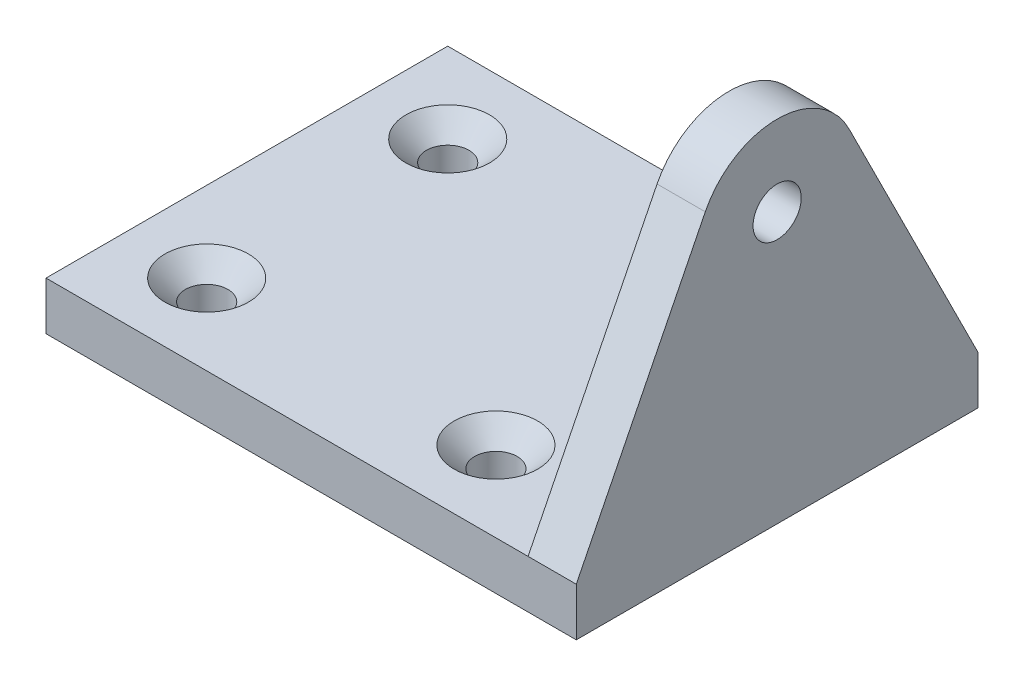
ISO-10303-21;
HEADER;
FILE_DESCRIPTION(('STEP AP214'),'2;1');
FILE_NAME('part.step','',(''),(''),'','','');
FILE_SCHEMA(('AUTOMOTIVE_DESIGN { 1 0 10303 214 1 1 1 1 }'));
ENDSEC;
DATA;
#1=APPLICATION_CONTEXT('core data for automotive mechanical design processes');
#2=APPLICATION_PROTOCOL_DEFINITION('international standard','automotive_design',2000,#1);
#3=PRODUCT_CONTEXT('',#1,'mechanical');
#4=PRODUCT('Part','Part','',(#3));
#5=PRODUCT_RELATED_PRODUCT_CATEGORY('part','',(#4));
#6=PRODUCT_DEFINITION_FORMATION('','',#4);
#7=PRODUCT_DEFINITION_CONTEXT('part definition',#1,'design');
#8=PRODUCT_DEFINITION('design','',#6,#7);
#9=PRODUCT_DEFINITION_SHAPE('','',#8);
#10=(LENGTH_UNIT() NAMED_UNIT(*) SI_UNIT(.MILLI.,.METRE.));
#11=(NAMED_UNIT(*) PLANE_ANGLE_UNIT() SI_UNIT($,.RADIAN.));
#12=(NAMED_UNIT(*) SI_UNIT($,.STERADIAN.) SOLID_ANGLE_UNIT());
#13=UNCERTAINTY_MEASURE_WITH_UNIT(LENGTH_MEASURE(1.E-05),#10,'distance_accuracy_value','');
#14=(GEOMETRIC_REPRESENTATION_CONTEXT(3) GLOBAL_UNCERTAINTY_ASSIGNED_CONTEXT((#13)) GLOBAL_UNIT_ASSIGNED_CONTEXT((#10,
#11,#12)) REPRESENTATION_CONTEXT('',''));
#15=CARTESIAN_POINT('',(0.,0.,0.));
#16=DIRECTION('',(0.,0.,1.));
#17=DIRECTION('',(1.,0.,0.));
#18=AXIS2_PLACEMENT_3D('',#15,#16,#17);
#19=CARTESIAN_POINT('',(-30.,6.,-25.));
#20=DIRECTION('',(0.,0.,1.));
#21=DIRECTION('',(1.,0.,0.));
#22=AXIS2_PLACEMENT_3D('',#19,#20,#21);
#23=PLANE('',#22);
#24=DIRECTION('',(-1.,0.,0.));
#25=VECTOR('',#24,1.);
#26=CARTESIAN_POINT('',(-30.,0.,-25.));
#27=LINE('',#26,#25);
#28=CARTESIAN_POINT('',(36.,0.,-25.));
#29=VERTEX_POINT('',#28);
#30=CARTESIAN_POINT('',(-30.,0.,-25.));
#31=VERTEX_POINT('',#30);
#32=EDGE_CURVE('E68',#29,#31,#27,.T.);
#33=ORIENTED_EDGE('',*,*,#32,.T.);
#34=DIRECTION('',(0.,-1.,0.));
#35=VECTOR('',#34,1.);
#36=CARTESIAN_POINT('',(-30.,6.,-25.));
#37=LINE('',#36,#35);
#38=CARTESIAN_POINT('',(-30.,6.,-25.));
#39=VERTEX_POINT('',#38);
#40=EDGE_CURVE('E11',#39,#31,#37,.T.);
#41=ORIENTED_EDGE('',*,*,#40,.F.);
#42=DIRECTION('',(-1.,0.,0.));
#43=VECTOR('',#42,1.);
#44=CARTESIAN_POINT('',(-30.,6.,-25.));
#45=LINE('',#44,#43);
#46=CARTESIAN_POINT('',(30.,6.,-25.));
#47=VERTEX_POINT('',#46);
#48=EDGE_CURVE('E121',#47,#39,#45,.T.);
#49=ORIENTED_EDGE('',*,*,#48,.F.);
#50=DIRECTION('',(-1.,0.,0.));
#51=VECTOR('',#50,1.);
#52=CARTESIAN_POINT('',(36.,6.,-25.));
#53=LINE('',#52,#51);
#54=CARTESIAN_POINT('',(36.,6.,-25.));
#55=VERTEX_POINT('',#54);
#56=EDGE_CURVE('E111',#55,#47,#53,.T.);
#57=ORIENTED_EDGE('',*,*,#56,.F.);
#58=DIRECTION('',(0.,1.,0.));
#59=VECTOR('',#58,1.);
#60=CARTESIAN_POINT('',(36.,0.,-25.));
#61=LINE('',#60,#59);
#62=EDGE_CURVE('E163',#29,#55,#61,.T.);
#63=ORIENTED_EDGE('',*,*,#62,.F.);
#64=EDGE_LOOP('',(#33,#41,#49,#57,#63));
#65=FACE_BOUND('',#64,.T.);
#66=ADVANCED_FACE('F39',(#65),#23,.F.);
#67=CARTESIAN_POINT('',(-30.,6.,-25.));
#68=DIRECTION('',(1.,0.,0.));
#69=DIRECTION('',(0.,0.,-1.));
#70=AXIS2_PLACEMENT_3D('',#67,#68,#69);
#71=PLANE('',#70);
#72=DIRECTION('',(0.,0.,1.));
#73=VECTOR('',#72,1.);
#74=CARTESIAN_POINT('',(-30.,0.,-25.));
#75=LINE('',#74,#73);
#76=CARTESIAN_POINT('',(-30.,0.,25.));
#77=VERTEX_POINT('',#76);
#78=EDGE_CURVE('E132',#31,#77,#75,.T.);
#79=ORIENTED_EDGE('',*,*,#78,.T.);
#80=DIRECTION('',(0.,-1.,0.));
#81=VECTOR('',#80,1.);
#82=CARTESIAN_POINT('',(-30.,6.,25.));
#83=LINE('',#82,#81);
#84=CARTESIAN_POINT('',(-30.,6.,25.));
#85=VERTEX_POINT('',#84);
#86=EDGE_CURVE('E48',#85,#77,#83,.T.);
#87=ORIENTED_EDGE('',*,*,#86,.F.);
#88=DIRECTION('',(0.,0.,1.));
#89=VECTOR('',#88,1.);
#90=CARTESIAN_POINT('',(-30.,6.,-25.));
#91=LINE('',#90,#89);
#92=EDGE_CURVE('E56',#39,#85,#91,.T.);
#93=ORIENTED_EDGE('',*,*,#92,.F.);
#94=ORIENTED_EDGE('',*,*,#40,.T.);
#95=EDGE_LOOP('',(#79,#87,#93,#94));
#96=FACE_BOUND('',#95,.T.);
#97=ADVANCED_FACE('F259',(#96),#71,.F.);
#98=CARTESIAN_POINT('',(-30.,6.,25.));
#99=DIRECTION('',(0.,0.,-1.));
#100=DIRECTION('',(-1.,0.,0.));
#101=AXIS2_PLACEMENT_3D('',#98,#99,#100);
#102=PLANE('',#101);
#103=DIRECTION('',(1.,0.,0.));
#104=VECTOR('',#103,1.);
#105=CARTESIAN_POINT('',(-30.,0.,25.));
#106=LINE('',#105,#104);
#107=CARTESIAN_POINT('',(36.,0.,25.));
#108=VERTEX_POINT('',#107);
#109=EDGE_CURVE('E128',#77,#108,#106,.T.);
#110=ORIENTED_EDGE('',*,*,#109,.T.);
#111=DIRECTION('',(0.,-1.,0.));
#112=VECTOR('',#111,1.);
#113=CARTESIAN_POINT('',(36.,6.,25.));
#114=LINE('',#113,#112);
#115=CARTESIAN_POINT('',(36.,6.,25.));
#116=VERTEX_POINT('',#115);
#117=EDGE_CURVE('E164',#116,#108,#114,.T.);
#118=ORIENTED_EDGE('',*,*,#117,.F.);
#119=DIRECTION('',(-1.,0.,0.));
#120=VECTOR('',#119,1.);
#121=CARTESIAN_POINT('',(36.,6.,25.));
#122=LINE('',#121,#120);
#123=CARTESIAN_POINT('',(30.,6.,25.));
#124=VERTEX_POINT('',#123);
#125=EDGE_CURVE('E184',#116,#124,#122,.T.);
#126=ORIENTED_EDGE('',*,*,#125,.T.);
#127=DIRECTION('',(1.,0.,0.));
#128=VECTOR('',#127,1.);
#129=CARTESIAN_POINT('',(-30.,6.,25.));
#130=LINE('',#129,#128);
#131=EDGE_CURVE('E126',#85,#124,#130,.T.);
#132=ORIENTED_EDGE('',*,*,#131,.F.);
#133=ORIENTED_EDGE('',*,*,#86,.T.);
#134=EDGE_LOOP('',(#110,#118,#126,#132,#133));
#135=FACE_BOUND('',#134,.T.);
#136=ADVANCED_FACE('F149',(#135),#102,.F.);
#137=CARTESIAN_POINT('',(0.,6.,0.));
#138=DIRECTION('',(0.,1.,0.));
#139=DIRECTION('',(0.,0.,1.));
#140=AXIS2_PLACEMENT_3D('',#137,#138,#139);
#141=PLANE('',#140);
#142=CARTESIAN_POINT('',(-20.,6.,15.));
#143=DIRECTION('',(0.,1.,0.));
#144=DIRECTION('',(0.,0.,1.));
#145=AXIS2_PLACEMENT_3D('',#142,#143,#144);
#146=CIRCLE('',#145,5.2);
#147=CARTESIAN_POINT('',(-20.,6.,20.2));
#148=VERTEX_POINT('',#147);
#149=EDGE_CURVE('E118',#148,#148,#146,.T.);
#150=ORIENTED_EDGE('',*,*,#149,.F.);
#151=EDGE_LOOP('',(#150));
#152=FACE_BOUND('',#151,.T.);
#153=CARTESIAN_POINT('',(16.,6.,15.));
#154=DIRECTION('',(0.,1.,0.));
#155=DIRECTION('',(0.,0.,1.));
#156=AXIS2_PLACEMENT_3D('',#153,#154,#155);
#157=CIRCLE('',#156,5.2);
#158=CARTESIAN_POINT('',(16.,6.,20.2));
#159=VERTEX_POINT('',#158);
#160=EDGE_CURVE('E207',#159,#159,#157,.T.);
#161=ORIENTED_EDGE('',*,*,#160,.F.);
#162=EDGE_LOOP('',(#161));
#163=FACE_BOUND('',#162,.T.);
#164=CARTESIAN_POINT('',(16.,6.,-15.));
#165=DIRECTION('',(0.,1.,0.));
#166=DIRECTION('',(0.,0.,1.));
#167=AXIS2_PLACEMENT_3D('',#164,#165,#166);
#168=CIRCLE('',#167,5.2);
#169=CARTESIAN_POINT('',(16.,6.,-9.8));
#170=VERTEX_POINT('',#169);
#171=EDGE_CURVE('E219',#170,#170,#168,.T.);
#172=ORIENTED_EDGE('',*,*,#171,.F.);
#173=EDGE_LOOP('',(#172));
#174=FACE_BOUND('',#173,.T.);
#175=CARTESIAN_POINT('',(-20.,6.,-15.));
#176=DIRECTION('',(0.,1.,0.));
#177=DIRECTION('',(0.,0.,1.));
#178=AXIS2_PLACEMENT_3D('',#175,#176,#177);
#179=CIRCLE('',#178,5.2);
#180=CARTESIAN_POINT('',(-20.,6.,-9.8));
#181=VERTEX_POINT('',#180);
#182=EDGE_CURVE('E231',#181,#181,#179,.T.);
#183=ORIENTED_EDGE('',*,*,#182,.F.);
#184=EDGE_LOOP('',(#183));
#185=FACE_BOUND('',#184,.T.);
#186=DIRECTION('',(0.,0.,-1.));
#187=VECTOR('',#186,1.);
#188=CARTESIAN_POINT('',(30.,6.,-25.));
#189=LINE('',#188,#187);
#190=EDGE_CURVE('E100',#124,#47,#189,.T.);
#191=ORIENTED_EDGE('',*,*,#190,.T.);
#192=ORIENTED_EDGE('',*,*,#48,.T.);
#193=ORIENTED_EDGE('',*,*,#92,.T.);
#194=ORIENTED_EDGE('',*,*,#131,.T.);
#195=EDGE_LOOP('',(#191,#192,#193,#194));
#196=FACE_BOUND('',#195,.T.);
#197=ADVANCED_FACE('F124',(#152,#163,#174,#185,#196),#141,.T.);
#198=CARTESIAN_POINT('',(0.,0.,0.));
#199=DIRECTION('',(0.,1.,0.));
#200=DIRECTION('',(0.,0.,1.));
#201=AXIS2_PLACEMENT_3D('',#198,#199,#200);
#202=PLANE('',#201);
#203=CARTESIAN_POINT('',(-20.,0.,15.));
#204=DIRECTION('',(0.,1.,0.));
#205=DIRECTION('',(0.,0.,1.));
#206=AXIS2_PLACEMENT_3D('',#203,#204,#205);
#207=CIRCLE('',#206,2.65);
#208=CARTESIAN_POINT('',(-20.,0.,17.65));
#209=VERTEX_POINT('',#208);
#210=EDGE_CURVE('E203',#209,#209,#207,.T.);
#211=ORIENTED_EDGE('',*,*,#210,.T.);
#212=EDGE_LOOP('',(#211));
#213=FACE_BOUND('',#212,.T.);
#214=CARTESIAN_POINT('',(16.,0.,15.));
#215=DIRECTION('',(0.,1.,0.));
#216=DIRECTION('',(0.,0.,1.));
#217=AXIS2_PLACEMENT_3D('',#214,#215,#216);
#218=CIRCLE('',#217,2.65);
#219=CARTESIAN_POINT('',(16.,0.,17.65));
#220=VERTEX_POINT('',#219);
#221=EDGE_CURVE('E215',#220,#220,#218,.T.);
#222=ORIENTED_EDGE('',*,*,#221,.T.);
#223=EDGE_LOOP('',(#222));
#224=FACE_BOUND('',#223,.T.);
#225=CARTESIAN_POINT('',(16.,0.,-15.));
#226=DIRECTION('',(0.,1.,0.));
#227=DIRECTION('',(0.,0.,1.));
#228=AXIS2_PLACEMENT_3D('',#225,#226,#227);
#229=CIRCLE('',#228,2.65);
#230=CARTESIAN_POINT('',(16.,0.,-12.35));
#231=VERTEX_POINT('',#230);
#232=EDGE_CURVE('E227',#231,#231,#229,.T.);
#233=ORIENTED_EDGE('',*,*,#232,.T.);
#234=EDGE_LOOP('',(#233));
#235=FACE_BOUND('',#234,.T.);
#236=CARTESIAN_POINT('',(-20.,0.,-15.));
#237=DIRECTION('',(0.,1.,0.));
#238=DIRECTION('',(0.,0.,1.));
#239=AXIS2_PLACEMENT_3D('',#236,#237,#238);
#240=CIRCLE('',#239,2.65);
#241=CARTESIAN_POINT('',(-20.,0.,-12.35));
#242=VERTEX_POINT('',#241);
#243=EDGE_CURVE('E135',#242,#242,#240,.T.);
#244=ORIENTED_EDGE('',*,*,#243,.T.);
#245=EDGE_LOOP('',(#244));
#246=FACE_BOUND('',#245,.T.);
#247=ORIENTED_EDGE('',*,*,#32,.F.);
#248=DIRECTION('',(0.,0.,-1.));
#249=VECTOR('',#248,1.);
#250=CARTESIAN_POINT('',(36.,0.,25.));
#251=LINE('',#250,#249);
#252=EDGE_CURVE('E158',#108,#29,#251,.T.);
#253=ORIENTED_EDGE('',*,*,#252,.F.);
#254=ORIENTED_EDGE('',*,*,#109,.F.);
#255=ORIENTED_EDGE('',*,*,#78,.F.);
#256=EDGE_LOOP('',(#247,#253,#254,#255));
#257=FACE_BOUND('',#256,.T.);
#258=ADVANCED_FACE('F156',(#213,#224,#235,#246,#257),#202,.F.);
#259=CARTESIAN_POINT('',(-20.,6.,-15.));
#260=DIRECTION('',(0.,1.,0.));
#261=DIRECTION('',(0.,0.,1.));
#262=AXIS2_PLACEMENT_3D('',#259,#260,#261);
#263=CYLINDRICAL_SURFACE('',#262,2.64999999999999);
#264=ORIENTED_EDGE('',*,*,#243,.F.);
#265=EDGE_LOOP('',(#264));
#266=FACE_BOUND('',#265,.T.);
#267=CARTESIAN_POINT('',(-20.,3.44999999999999,-15.));
#268=DIRECTION('',(0.,1.,0.));
#269=DIRECTION('',(0.,0.,1.));
#270=AXIS2_PLACEMENT_3D('',#267,#268,#269);
#271=CIRCLE('',#270,2.64999999999999);
#272=CARTESIAN_POINT('',(-20.,3.44999999999999,-12.35));
#273=VERTEX_POINT('',#272);
#274=EDGE_CURVE('E234',#273,#273,#271,.T.);
#275=ORIENTED_EDGE('',*,*,#274,.T.);
#276=EDGE_LOOP('',(#275));
#277=FACE_BOUND('',#276,.T.);
#278=ADVANCED_FACE('F244',(#266,#277),#263,.F.);
#279=CARTESIAN_POINT('',(-20.,6.,-15.));
#280=DIRECTION('',(0.,1.,0.));
#281=DIRECTION('',(0.,0.,1.));
#282=AXIS2_PLACEMENT_3D('',#279,#280,#281);
#283=CONICAL_SURFACE('',#282,5.2,0.785398163397449);
#284=ORIENTED_EDGE('',*,*,#274,.F.);
#285=EDGE_LOOP('',(#284));
#286=FACE_BOUND('',#285,.T.);
#287=ORIENTED_EDGE('',*,*,#182,.T.);
#288=EDGE_LOOP('',(#287));
#289=FACE_BOUND('',#288,.T.);
#290=ADVANCED_FACE('F246',(#286,#289),#283,.F.);
#291=CARTESIAN_POINT('',(16.,6.,-15.));
#292=DIRECTION('',(0.,1.,0.));
#293=DIRECTION('',(0.,0.,1.));
#294=AXIS2_PLACEMENT_3D('',#291,#292,#293);
#295=CYLINDRICAL_SURFACE('',#294,2.64999999999999);
#296=ORIENTED_EDGE('',*,*,#232,.F.);
#297=EDGE_LOOP('',(#296));
#298=FACE_BOUND('',#297,.T.);
#299=CARTESIAN_POINT('',(16.,3.44999999999999,-15.));
#300=DIRECTION('',(0.,1.,0.));
#301=DIRECTION('',(0.,0.,1.));
#302=AXIS2_PLACEMENT_3D('',#299,#300,#301);
#303=CIRCLE('',#302,2.64999999999999);
#304=CARTESIAN_POINT('',(16.,3.44999999999999,-12.35));
#305=VERTEX_POINT('',#304);
#306=EDGE_CURVE('E223',#305,#305,#303,.T.);
#307=ORIENTED_EDGE('',*,*,#306,.T.);
#308=EDGE_LOOP('',(#307));
#309=FACE_BOUND('',#308,.T.);
#310=ADVANCED_FACE('F252',(#298,#309),#295,.F.);
#311=CARTESIAN_POINT('',(16.,6.,-15.));
#312=DIRECTION('',(0.,1.,0.));
#313=DIRECTION('',(0.,0.,1.));
#314=AXIS2_PLACEMENT_3D('',#311,#312,#313);
#315=CONICAL_SURFACE('',#314,5.2,0.785398163397448);
#316=ORIENTED_EDGE('',*,*,#306,.F.);
#317=EDGE_LOOP('',(#316));
#318=FACE_BOUND('',#317,.T.);
#319=ORIENTED_EDGE('',*,*,#171,.T.);
#320=EDGE_LOOP('',(#319));
#321=FACE_BOUND('',#320,.T.);
#322=ADVANCED_FACE('F280',(#318,#321),#315,.F.);
#323=CARTESIAN_POINT('',(16.,6.,15.));
#324=DIRECTION('',(0.,1.,0.));
#325=DIRECTION('',(0.,0.,1.));
#326=AXIS2_PLACEMENT_3D('',#323,#324,#325);
#327=CYLINDRICAL_SURFACE('',#326,2.64999999999999);
#328=ORIENTED_EDGE('',*,*,#221,.F.);
#329=EDGE_LOOP('',(#328));
#330=FACE_BOUND('',#329,.T.);
#331=CARTESIAN_POINT('',(16.,3.44999999999999,15.));
#332=DIRECTION('',(0.,1.,0.));
#333=DIRECTION('',(0.,0.,1.));
#334=AXIS2_PLACEMENT_3D('',#331,#332,#333);
#335=CIRCLE('',#334,2.64999999999999);
#336=CARTESIAN_POINT('',(16.,3.44999999999999,17.65));
#337=VERTEX_POINT('',#336);
#338=EDGE_CURVE('E211',#337,#337,#335,.T.);
#339=ORIENTED_EDGE('',*,*,#338,.T.);
#340=EDGE_LOOP('',(#339));
#341=FACE_BOUND('',#340,.T.);
#342=ADVANCED_FACE('F282',(#330,#341),#327,.F.);
#343=CARTESIAN_POINT('',(16.,6.,15.));
#344=DIRECTION('',(0.,1.,0.));
#345=DIRECTION('',(0.,0.,1.));
#346=AXIS2_PLACEMENT_3D('',#343,#344,#345);
#347=CONICAL_SURFACE('',#346,5.2,0.785398163397448);
#348=ORIENTED_EDGE('',*,*,#338,.F.);
#349=EDGE_LOOP('',(#348));
#350=FACE_BOUND('',#349,.T.);
#351=ORIENTED_EDGE('',*,*,#160,.T.);
#352=EDGE_LOOP('',(#351));
#353=FACE_BOUND('',#352,.T.);
#354=ADVANCED_FACE('F289',(#350,#353),#347,.F.);
#355=CARTESIAN_POINT('',(-20.,6.,15.));
#356=DIRECTION('',(0.,1.,0.));
#357=DIRECTION('',(0.,0.,1.));
#358=AXIS2_PLACEMENT_3D('',#355,#356,#357);
#359=CYLINDRICAL_SURFACE('',#358,2.64999999999999);
#360=ORIENTED_EDGE('',*,*,#210,.F.);
#361=EDGE_LOOP('',(#360));
#362=FACE_BOUND('',#361,.T.);
#363=CARTESIAN_POINT('',(-20.,3.44999999999999,15.));
#364=DIRECTION('',(0.,1.,0.));
#365=DIRECTION('',(0.,0.,1.));
#366=AXIS2_PLACEMENT_3D('',#363,#364,#365);
#367=CIRCLE('',#366,2.64999999999999);
#368=CARTESIAN_POINT('',(-20.,3.44999999999999,17.65));
#369=VERTEX_POINT('',#368);
#370=EDGE_CURVE('E199',#369,#369,#367,.T.);
#371=ORIENTED_EDGE('',*,*,#370,.T.);
#372=EDGE_LOOP('',(#371));
#373=FACE_BOUND('',#372,.T.);
#374=ADVANCED_FACE('F298',(#362,#373),#359,.F.);
#375=CARTESIAN_POINT('',(-20.,6.,15.));
#376=DIRECTION('',(0.,1.,0.));
#377=DIRECTION('',(0.,0.,1.));
#378=AXIS2_PLACEMENT_3D('',#375,#376,#377);
#379=CONICAL_SURFACE('',#378,5.2,0.785398163397448);
#380=ORIENTED_EDGE('',*,*,#370,.F.);
#381=EDGE_LOOP('',(#380));
#382=FACE_BOUND('',#381,.T.);
#383=ORIENTED_EDGE('',*,*,#149,.T.);
#384=EDGE_LOOP('',(#383));
#385=FACE_BOUND('',#384,.T.);
#386=ADVANCED_FACE('F302',(#382,#385),#379,.F.);
#387=CARTESIAN_POINT('',(36.,38.1114561800015,-8.94427190999924));
#388=DIRECTION('',(0.,-0.447213595499958,0.894427190999916));
#389=DIRECTION('',(0.,-0.894427190999916,-0.447213595499958));
#390=AXIS2_PLACEMENT_3D('',#387,#388,#389);
#391=PLANE('',#390);
#392=DIRECTION('',(0.,0.894427190999916,0.447213595499958));
#393=VECTOR('',#392,1.);
#394=CARTESIAN_POINT('',(30.,38.1114561800015,-8.94427190999924));
#395=LINE('',#394,#393);
#396=CARTESIAN_POINT('',(30.,38.1114561800015,-8.94427190999924));
#397=VERTEX_POINT('',#396);
#398=EDGE_CURVE('E95',#47,#397,#395,.T.);
#399=ORIENTED_EDGE('',*,*,#398,.T.);
#400=DIRECTION('',(-1.,0.,0.));
#401=VECTOR('',#400,1.);
#402=CARTESIAN_POINT('',(36.,38.1114561800015,-8.94427190999924));
#403=LINE('',#402,#401);
#404=CARTESIAN_POINT('',(36.,38.1114561800015,-8.94427190999924));
#405=VERTEX_POINT('',#404);
#406=EDGE_CURVE('E119',#405,#397,#403,.T.);
#407=ORIENTED_EDGE('',*,*,#406,.F.);
#408=DIRECTION('',(0.,0.894427190999916,0.447213595499958));
#409=VECTOR('',#408,1.);
#410=CARTESIAN_POINT('',(36.,38.1114561800015,-8.94427190999924));
#411=LINE('',#410,#409);
#412=EDGE_CURVE('E116',#55,#405,#411,.T.);
#413=ORIENTED_EDGE('',*,*,#412,.F.);
#414=ORIENTED_EDGE('',*,*,#56,.T.);
#415=EDGE_LOOP('',(#399,#407,#413,#414));
#416=FACE_BOUND('',#415,.T.);
#417=ADVANCED_FACE('F113',(#416),#391,.F.);
#418=CARTESIAN_POINT('',(36.,33.6393202250021,0.));
#419=DIRECTION('',(-1.,0.,0.));
#420=DIRECTION('',(0.,0.,1.));
#421=AXIS2_PLACEMENT_3D('',#418,#419,#420);
#422=CYLINDRICAL_SURFACE('',#421,10.);
#423=CARTESIAN_POINT('',(30.,33.6393202250021,0.));
#424=DIRECTION('',(1.,0.,0.));
#425=DIRECTION('',(0.,0.,-1.));
#426=AXIS2_PLACEMENT_3D('',#423,#424,#425);
#427=CIRCLE('',#426,10.);
#428=CARTESIAN_POINT('',(30.,38.1114561800015,8.94427190999924));
#429=VERTEX_POINT('',#428);
#430=EDGE_CURVE('E102',#397,#429,#427,.T.);
#431=ORIENTED_EDGE('',*,*,#430,.T.);
#432=DIRECTION('',(-1.,0.,0.));
#433=VECTOR('',#432,1.);
#434=CARTESIAN_POINT('',(36.,38.1114561800015,8.94427190999924));
#435=LINE('',#434,#433);
#436=CARTESIAN_POINT('',(36.,38.1114561800015,8.94427190999924));
#437=VERTEX_POINT('',#436);
#438=EDGE_CURVE('E190',#437,#429,#435,.T.);
#439=ORIENTED_EDGE('',*,*,#438,.F.);
#440=CARTESIAN_POINT('',(36.,33.6393202250021,0.));
#441=DIRECTION('',(1.,0.,0.));
#442=DIRECTION('',(0.,0.,-1.));
#443=AXIS2_PLACEMENT_3D('',#440,#441,#442);
#444=CIRCLE('',#443,10.);
#445=EDGE_CURVE('E180',#405,#437,#444,.T.);
#446=ORIENTED_EDGE('',*,*,#445,.F.);
#447=ORIENTED_EDGE('',*,*,#406,.T.);
#448=EDGE_LOOP('',(#431,#439,#446,#447));
#449=FACE_BOUND('',#448,.T.);
#450=ADVANCED_FACE('F309',(#449),#422,.T.);
#451=CARTESIAN_POINT('',(36.,6.,25.));
#452=DIRECTION('',(0.,-0.447213595499958,-0.894427190999916));
#453=DIRECTION('',(0.,0.894427190999916,-0.447213595499958));
#454=AXIS2_PLACEMENT_3D('',#451,#452,#453);
#455=PLANE('',#454);
#456=DIRECTION('',(0.,-0.894427190999916,0.447213595499958));
#457=VECTOR('',#456,1.);
#458=CARTESIAN_POINT('',(30.,6.,25.));
#459=LINE('',#458,#457);
#460=EDGE_CURVE('E168',#429,#124,#459,.T.);
#461=ORIENTED_EDGE('',*,*,#460,.T.);
#462=ORIENTED_EDGE('',*,*,#125,.F.);
#463=DIRECTION('',(0.,-0.894427190999916,0.447213595499958));
#464=VECTOR('',#463,1.);
#465=CARTESIAN_POINT('',(36.,6.,25.));
#466=LINE('',#465,#464);
#467=EDGE_CURVE('E77',#437,#116,#466,.T.);
#468=ORIENTED_EDGE('',*,*,#467,.F.);
#469=ORIENTED_EDGE('',*,*,#438,.T.);
#470=EDGE_LOOP('',(#461,#462,#468,#469));
#471=FACE_BOUND('',#470,.T.);
#472=ADVANCED_FACE('F312',(#471),#455,.F.);
#473=CARTESIAN_POINT('',(36.,33.6393202250021,0.));
#474=DIRECTION('',(1.,0.,0.));
#475=DIRECTION('',(0.,0.,-1.));
#476=AXIS2_PLACEMENT_3D('',#473,#474,#475);
#477=PLANE('',#476);
#478=CARTESIAN_POINT('',(36.,33.6393202250021,0.));
#479=DIRECTION('',(1.,0.,0.));
#480=DIRECTION('',(0.,0.,-1.));
#481=AXIS2_PLACEMENT_3D('',#478,#479,#480);
#482=CIRCLE('',#481,3.);
#483=CARTESIAN_POINT('',(36.,33.6393202250021,-3.));
#484=VERTEX_POINT('',#483);
#485=EDGE_CURVE('E173',#484,#484,#482,.T.);
#486=ORIENTED_EDGE('',*,*,#485,.F.);
#487=EDGE_LOOP('',(#486));
#488=FACE_BOUND('',#487,.T.);
#489=ORIENTED_EDGE('',*,*,#117,.T.);
#490=ORIENTED_EDGE('',*,*,#252,.T.);
#491=ORIENTED_EDGE('',*,*,#62,.T.);
#492=ORIENTED_EDGE('',*,*,#412,.T.);
#493=ORIENTED_EDGE('',*,*,#445,.T.);
#494=ORIENTED_EDGE('',*,*,#467,.T.);
#495=EDGE_LOOP('',(#489,#490,#491,#492,#493,#494));
#496=FACE_BOUND('',#495,.T.);
#497=ADVANCED_FACE('F166',(#488,#496),#477,.T.);
#498=CARTESIAN_POINT('',(30.,33.6393202250021,0.));
#499=DIRECTION('',(1.,0.,0.));
#500=DIRECTION('',(0.,0.,-1.));
#501=AXIS2_PLACEMENT_3D('',#498,#499,#500);
#502=PLANE('',#501);
#503=CARTESIAN_POINT('',(30.,33.6393202250021,0.));
#504=DIRECTION('',(1.,0.,0.));
#505=DIRECTION('',(0.,0.,-1.));
#506=AXIS2_PLACEMENT_3D('',#503,#504,#505);
#507=CIRCLE('',#506,3.);
#508=CARTESIAN_POINT('',(30.,33.6393202250021,-3.));
#509=VERTEX_POINT('',#508);
#510=EDGE_CURVE('E107',#509,#509,#507,.T.);
#511=ORIENTED_EDGE('',*,*,#510,.T.);
#512=EDGE_LOOP('',(#511));
#513=FACE_BOUND('',#512,.T.);
#514=ORIENTED_EDGE('',*,*,#190,.F.);
#515=ORIENTED_EDGE('',*,*,#460,.F.);
#516=ORIENTED_EDGE('',*,*,#430,.F.);
#517=ORIENTED_EDGE('',*,*,#398,.F.);
#518=EDGE_LOOP('',(#514,#515,#516,#517));
#519=FACE_BOUND('',#518,.T.);
#520=ADVANCED_FACE('F97',(#513,#519),#502,.F.);
#521=CARTESIAN_POINT('',(30.,33.6393202250021,0.));
#522=DIRECTION('',(1.,0.,0.));
#523=DIRECTION('',(0.,0.,-1.));
#524=AXIS2_PLACEMENT_3D('',#521,#522,#523);
#525=CYLINDRICAL_SURFACE('',#524,3.);
#526=ORIENTED_EDGE('',*,*,#510,.F.);
#527=EDGE_LOOP('',(#526));
#528=FACE_BOUND('',#527,.T.);
#529=ORIENTED_EDGE('',*,*,#485,.T.);
#530=EDGE_LOOP('',(#529));
#531=FACE_BOUND('',#530,.T.);
#532=ADVANCED_FACE('F319',(#528,#531),#525,.F.);
#533=CLOSED_SHELL('',(#66,#97,#136,#197,#258,#278,#290,#310,#322,#342,#354,#374,#386,#417,#450,
#472,#497,#520,#532));
#534=MANIFOLD_SOLID_BREP('B2',#533);
#535=ADVANCED_BREP_SHAPE_REPRESENTATION('',(#18,#534),#14);
#536=SHAPE_DEFINITION_REPRESENTATION(#9,#535);
ENDSEC;
END-ISO-10303-21;
